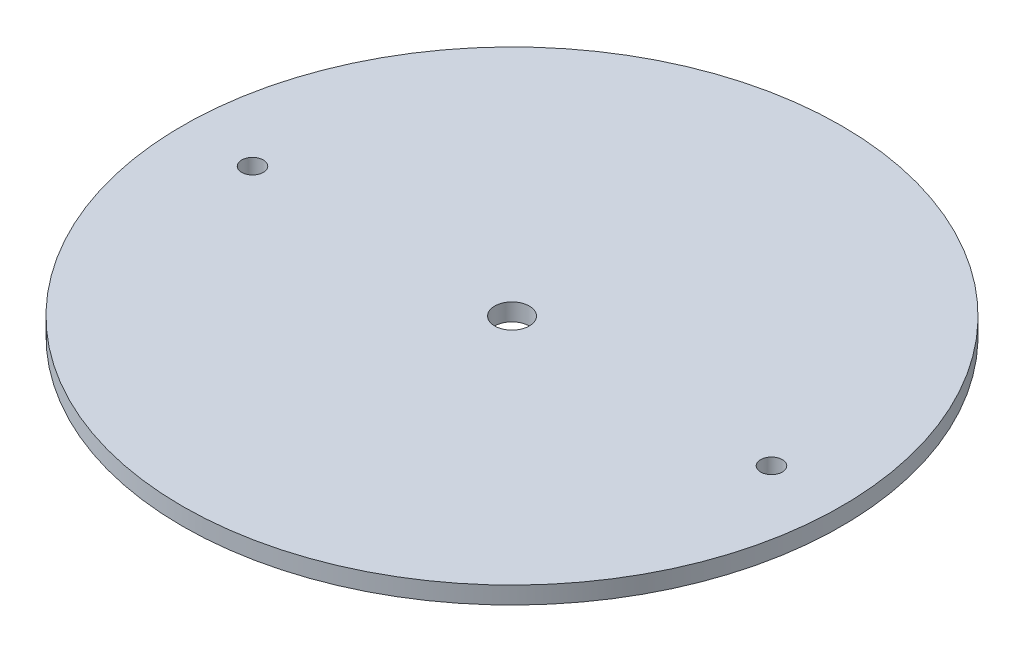
ISO-10303-21;
HEADER;
FILE_DESCRIPTION(('STEP AP214'),'2;1');
FILE_NAME('part.step','',(''),(''),'','','');
FILE_SCHEMA(('AUTOMOTIVE_DESIGN { 1 0 10303 214 1 1 1 1 }'));
ENDSEC;
DATA;
#1=APPLICATION_CONTEXT('core data for automotive mechanical design processes');
#2=APPLICATION_PROTOCOL_DEFINITION('international standard','automotive_design',2000,#1);
#3=PRODUCT_CONTEXT('',#1,'mechanical');
#4=PRODUCT('Part','Part','',(#3));
#5=PRODUCT_RELATED_PRODUCT_CATEGORY('part','',(#4));
#6=PRODUCT_DEFINITION_FORMATION('','',#4);
#7=PRODUCT_DEFINITION_CONTEXT('part definition',#1,'design');
#8=PRODUCT_DEFINITION('design','',#6,#7);
#9=PRODUCT_DEFINITION_SHAPE('','',#8);
#10=(LENGTH_UNIT() NAMED_UNIT(*) SI_UNIT(.MILLI.,.METRE.));
#11=(NAMED_UNIT(*) PLANE_ANGLE_UNIT() SI_UNIT($,.RADIAN.));
#12=(NAMED_UNIT(*) SI_UNIT($,.STERADIAN.) SOLID_ANGLE_UNIT());
#13=UNCERTAINTY_MEASURE_WITH_UNIT(LENGTH_MEASURE(1.E-05),#10,'distance_accuracy_value','');
#14=(GEOMETRIC_REPRESENTATION_CONTEXT(3) GLOBAL_UNCERTAINTY_ASSIGNED_CONTEXT((#13)) GLOBAL_UNIT_ASSIGNED_CONTEXT((#10,
#11,#12)) REPRESENTATION_CONTEXT('',''));
#15=CARTESIAN_POINT('',(0.,0.,0.));
#16=DIRECTION('',(0.,0.,1.));
#17=DIRECTION('',(1.,0.,0.));
#18=AXIS2_PLACEMENT_3D('',#15,#16,#17);
#19=CARTESIAN_POINT('',(-60.,4.,0.));
#20=DIRECTION('',(0.,-1.,0.));
#21=DIRECTION('',(0.,0.,-1.));
#22=AXIS2_PLACEMENT_3D('',#19,#20,#21);
#23=CYLINDRICAL_SURFACE('',#22,2.5);
#24=CARTESIAN_POINT('',(-60.,4.,0.));
#25=DIRECTION('',(0.,1.,0.));
#26=DIRECTION('',(0.,0.,1.));
#27=AXIS2_PLACEMENT_3D('',#24,#25,#26);
#28=CIRCLE('',#27,2.5);
#29=CARTESIAN_POINT('',(-60.,4.,2.50000000000001));
#30=VERTEX_POINT('',#29);
#31=EDGE_CURVE('E41',#30,#30,#28,.T.);
#32=ORIENTED_EDGE('',*,*,#31,.T.);
#33=EDGE_LOOP('',(#32));
#34=FACE_BOUND('',#33,.T.);
#35=CARTESIAN_POINT('',(-60.,0.,0.));
#36=DIRECTION('',(0.,1.,0.));
#37=DIRECTION('',(0.,0.,1.));
#38=AXIS2_PLACEMENT_3D('',#35,#36,#37);
#39=CIRCLE('',#38,2.5);
#40=CARTESIAN_POINT('',(-60.,0.,2.50000000000001));
#41=VERTEX_POINT('',#40);
#42=EDGE_CURVE('E55',#41,#41,#39,.T.);
#43=ORIENTED_EDGE('',*,*,#42,.F.);
#44=EDGE_LOOP('',(#43));
#45=FACE_BOUND('',#44,.T.);
#46=ADVANCED_FACE('F33',(#34,#45),#23,.F.);
#47=CARTESIAN_POINT('',(0.,4.,0.));
#48=DIRECTION('',(0.,-1.,0.));
#49=DIRECTION('',(0.,0.,-1.));
#50=AXIS2_PLACEMENT_3D('',#47,#48,#49);
#51=CYLINDRICAL_SURFACE('',#50,4.);
#52=CARTESIAN_POINT('',(0.,4.,0.));
#53=DIRECTION('',(0.,1.,0.));
#54=DIRECTION('',(0.,0.,1.));
#55=AXIS2_PLACEMENT_3D('',#52,#53,#54);
#56=CIRCLE('',#55,4.);
#57=CARTESIAN_POINT('',(0.,4.,4.));
#58=VERTEX_POINT('',#57);
#59=EDGE_CURVE('E46',#58,#58,#56,.T.);
#60=ORIENTED_EDGE('',*,*,#59,.T.);
#61=EDGE_LOOP('',(#60));
#62=FACE_BOUND('',#61,.T.);
#63=CARTESIAN_POINT('',(0.,0.,0.));
#64=DIRECTION('',(0.,1.,0.));
#65=DIRECTION('',(0.,0.,1.));
#66=AXIS2_PLACEMENT_3D('',#63,#64,#65);
#67=CIRCLE('',#66,4.);
#68=CARTESIAN_POINT('',(0.,0.,4.));
#69=VERTEX_POINT('',#68);
#70=EDGE_CURVE('E53',#69,#69,#67,.T.);
#71=ORIENTED_EDGE('',*,*,#70,.F.);
#72=EDGE_LOOP('',(#71));
#73=FACE_BOUND('',#72,.T.);
#74=ADVANCED_FACE('F70',(#62,#73),#51,.F.);
#75=CARTESIAN_POINT('',(0.,4.,0.));
#76=DIRECTION('',(0.,-1.,0.));
#77=DIRECTION('',(0.,0.,-1.));
#78=AXIS2_PLACEMENT_3D('',#75,#76,#77);
#79=CYLINDRICAL_SURFACE('',#78,76.2);
#80=CARTESIAN_POINT('',(0.,4.,0.));
#81=DIRECTION('',(0.,1.,0.));
#82=DIRECTION('',(0.,0.,1.));
#83=AXIS2_PLACEMENT_3D('',#80,#81,#82);
#84=CIRCLE('',#83,76.2);
#85=CARTESIAN_POINT('',(0.,4.,76.2));
#86=VERTEX_POINT('',#85);
#87=EDGE_CURVE('E60',#86,#86,#84,.T.);
#88=ORIENTED_EDGE('',*,*,#87,.F.);
#89=EDGE_LOOP('',(#88));
#90=FACE_BOUND('',#89,.T.);
#91=CARTESIAN_POINT('',(0.,0.,0.));
#92=DIRECTION('',(0.,1.,0.));
#93=DIRECTION('',(0.,0.,1.));
#94=AXIS2_PLACEMENT_3D('',#91,#92,#93);
#95=CIRCLE('',#94,76.2);
#96=CARTESIAN_POINT('',(0.,0.,76.2));
#97=VERTEX_POINT('',#96);
#98=EDGE_CURVE('E50',#97,#97,#95,.T.);
#99=ORIENTED_EDGE('',*,*,#98,.T.);
#100=EDGE_LOOP('',(#99));
#101=FACE_BOUND('',#100,.T.);
#102=ADVANCED_FACE('F35',(#90,#101),#79,.T.);
#103=CARTESIAN_POINT('',(60.,4.,0.));
#104=DIRECTION('',(0.,-1.,0.));
#105=DIRECTION('',(0.,0.,-1.));
#106=AXIS2_PLACEMENT_3D('',#103,#104,#105);
#107=CYLINDRICAL_SURFACE('',#106,2.5);
#108=CARTESIAN_POINT('',(60.,4.,0.));
#109=DIRECTION('',(0.,1.,0.));
#110=DIRECTION('',(0.,0.,1.));
#111=AXIS2_PLACEMENT_3D('',#108,#109,#110);
#112=CIRCLE('',#111,2.5);
#113=CARTESIAN_POINT('',(60.,4.,2.50000000000001));
#114=VERTEX_POINT('',#113);
#115=EDGE_CURVE('E10',#114,#114,#112,.F.);
#116=ORIENTED_EDGE('',*,*,#115,.F.);
#117=EDGE_LOOP('',(#116));
#118=FACE_BOUND('',#117,.T.);
#119=CARTESIAN_POINT('',(60.,0.,0.));
#120=DIRECTION('',(0.,1.,0.));
#121=DIRECTION('',(0.,0.,1.));
#122=AXIS2_PLACEMENT_3D('',#119,#120,#121);
#123=CIRCLE('',#122,2.5);
#124=CARTESIAN_POINT('',(60.,0.,2.50000000000001));
#125=VERTEX_POINT('',#124);
#126=EDGE_CURVE('E37',#125,#125,#123,.F.);
#127=ORIENTED_EDGE('',*,*,#126,.T.);
#128=EDGE_LOOP('',(#127));
#129=FACE_BOUND('',#128,.T.);
#130=ADVANCED_FACE('F77',(#118,#129),#107,.F.);
#131=CARTESIAN_POINT('',(0.,4.,0.));
#132=DIRECTION('',(0.,1.,0.));
#133=DIRECTION('',(0.,0.,1.));
#134=AXIS2_PLACEMENT_3D('',#131,#132,#133);
#135=PLANE('',#134);
#136=ORIENTED_EDGE('',*,*,#87,.T.);
#137=EDGE_LOOP('',(#136));
#138=FACE_BOUND('',#137,.T.);
#139=ORIENTED_EDGE('',*,*,#59,.F.);
#140=EDGE_LOOP('',(#139));
#141=FACE_BOUND('',#140,.T.);
#142=ORIENTED_EDGE('',*,*,#31,.F.);
#143=EDGE_LOOP('',(#142));
#144=FACE_BOUND('',#143,.T.);
#145=ORIENTED_EDGE('',*,*,#115,.T.);
#146=EDGE_LOOP('',(#145));
#147=FACE_BOUND('',#146,.T.);
#148=ADVANCED_FACE('F73',(#138,#141,#144,#147),#135,.T.);
#149=CARTESIAN_POINT('',(0.,0.,0.));
#150=DIRECTION('',(0.,1.,0.));
#151=DIRECTION('',(0.,0.,1.));
#152=AXIS2_PLACEMENT_3D('',#149,#150,#151);
#153=PLANE('',#152);
#154=ORIENTED_EDGE('',*,*,#98,.F.);
#155=EDGE_LOOP('',(#154));
#156=FACE_BOUND('',#155,.T.);
#157=ORIENTED_EDGE('',*,*,#70,.T.);
#158=EDGE_LOOP('',(#157));
#159=FACE_BOUND('',#158,.T.);
#160=ORIENTED_EDGE('',*,*,#42,.T.);
#161=EDGE_LOOP('',(#160));
#162=FACE_BOUND('',#161,.T.);
#163=ORIENTED_EDGE('',*,*,#126,.F.);
#164=EDGE_LOOP('',(#163));
#165=FACE_BOUND('',#164,.T.);
#166=ADVANCED_FACE('F76',(#156,#159,#162,#165),#153,.F.);
#167=CLOSED_SHELL('',(#46,#74,#102,#130,#148,#166));
#168=MANIFOLD_SOLID_BREP('B2',#167);
#169=ADVANCED_BREP_SHAPE_REPRESENTATION('',(#18,#168),#14);
#170=SHAPE_DEFINITION_REPRESENTATION(#9,#169);
ENDSEC;
END-ISO-10303-21;
